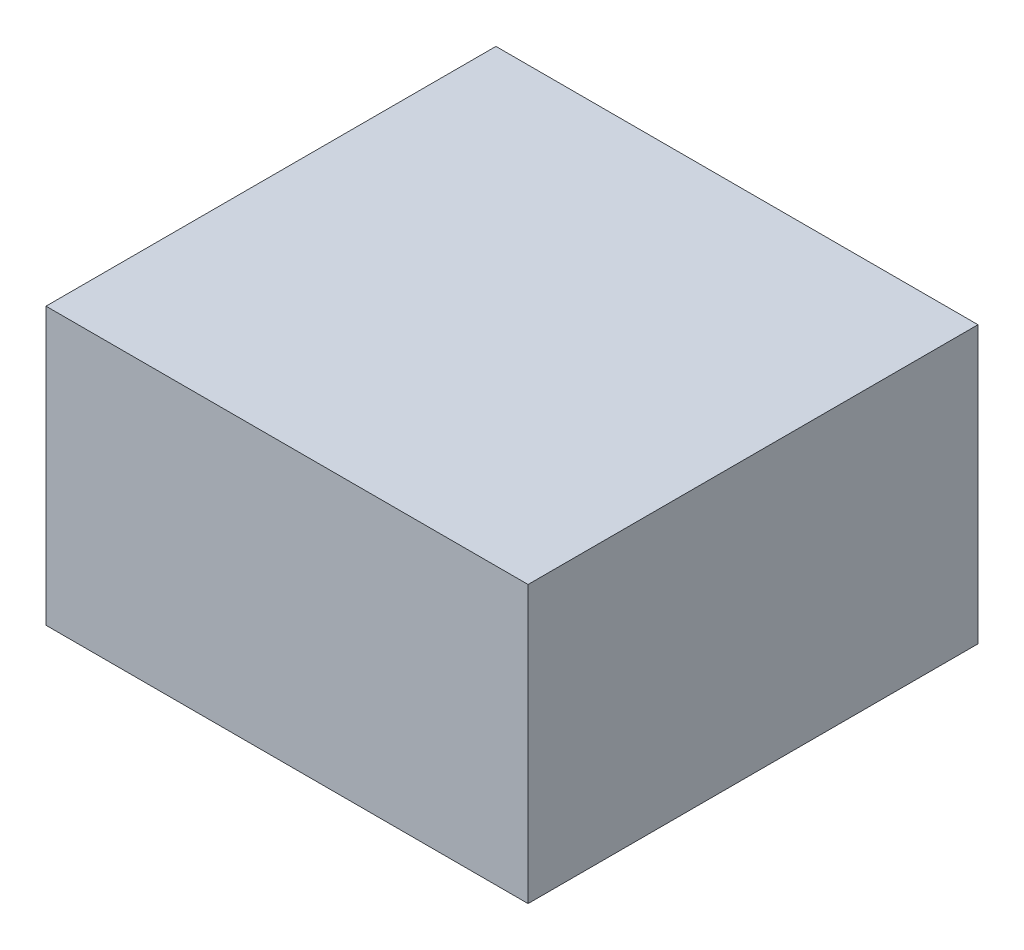
ISO-10303-21;
HEADER;
FILE_DESCRIPTION(('STEP AP214'),'2;1');
FILE_NAME('part.step','',(''),(''),'','','');
FILE_SCHEMA(('AUTOMOTIVE_DESIGN { 1 0 10303 214 1 1 1 1 }'));
ENDSEC;
DATA;
#1=APPLICATION_CONTEXT('core data for automotive mechanical design processes');
#2=APPLICATION_PROTOCOL_DEFINITION('international standard','automotive_design',2000,#1);
#3=PRODUCT_CONTEXT('',#1,'mechanical');
#4=PRODUCT('Part','Part','',(#3));
#5=PRODUCT_RELATED_PRODUCT_CATEGORY('part','',(#4));
#6=PRODUCT_DEFINITION_FORMATION('','',#4);
#7=PRODUCT_DEFINITION_CONTEXT('part definition',#1,'design');
#8=PRODUCT_DEFINITION('design','',#6,#7);
#9=PRODUCT_DEFINITION_SHAPE('','',#8);
#10=(LENGTH_UNIT() NAMED_UNIT(*) SI_UNIT(.MILLI.,.METRE.));
#11=(NAMED_UNIT(*) PLANE_ANGLE_UNIT() SI_UNIT($,.RADIAN.));
#12=(NAMED_UNIT(*) SI_UNIT($,.STERADIAN.) SOLID_ANGLE_UNIT());
#13=UNCERTAINTY_MEASURE_WITH_UNIT(LENGTH_MEASURE(1.E-05),#10,'distance_accuracy_value','');
#14=(GEOMETRIC_REPRESENTATION_CONTEXT(3) GLOBAL_UNCERTAINTY_ASSIGNED_CONTEXT((#13)) GLOBAL_UNIT_ASSIGNED_CONTEXT((#10,
#11,#12)) REPRESENTATION_CONTEXT('',''));
#15=CARTESIAN_POINT('',(0.,0.,0.));
#16=DIRECTION('',(0.,0.,1.));
#17=DIRECTION('',(1.,0.,0.));
#18=AXIS2_PLACEMENT_3D('',#15,#16,#17);
#19=CARTESIAN_POINT('',(0.,0.,140.));
#20=DIRECTION('',(1.,0.,0.));
#21=DIRECTION('',(0.,0.,-1.));
#22=AXIS2_PLACEMENT_3D('',#19,#20,#21);
#23=PLANE('',#22);
#24=DIRECTION('',(0.,-1.,0.));
#25=VECTOR('',#24,1.);
#26=CARTESIAN_POINT('',(0.,0.,0.));
#27=LINE('',#26,#25);
#28=CARTESIAN_POINT('',(0.,86.,0.));
#29=VERTEX_POINT('',#28);
#30=CARTESIAN_POINT('',(0.,0.,0.));
#31=VERTEX_POINT('',#30);
#32=EDGE_CURVE('E98',#29,#31,#27,.T.);
#33=ORIENTED_EDGE('',*,*,#32,.T.);
#34=DIRECTION('',(0.,0.,-1.));
#35=VECTOR('',#34,1.);
#36=CARTESIAN_POINT('',(0.,0.,140.));
#37=LINE('',#36,#35);
#38=CARTESIAN_POINT('',(0.,0.,140.));
#39=VERTEX_POINT('',#38);
#40=EDGE_CURVE('E11',#39,#31,#37,.T.);
#41=ORIENTED_EDGE('',*,*,#40,.F.);
#42=DIRECTION('',(0.,-1.,0.));
#43=VECTOR('',#42,1.);
#44=CARTESIAN_POINT('',(0.,0.,140.));
#45=LINE('',#44,#43);
#46=CARTESIAN_POINT('',(0.,86.,140.));
#47=VERTEX_POINT('',#46);
#48=EDGE_CURVE('E86',#47,#39,#45,.T.);
#49=ORIENTED_EDGE('',*,*,#48,.F.);
#50=DIRECTION('',(0.,0.,-1.));
#51=VECTOR('',#50,1.);
#52=CARTESIAN_POINT('',(0.,86.,140.));
#53=LINE('',#52,#51);
#54=EDGE_CURVE('E94',#47,#29,#53,.T.);
#55=ORIENTED_EDGE('',*,*,#54,.T.);
#56=EDGE_LOOP('',(#33,#41,#49,#55));
#57=FACE_BOUND('',#56,.T.);
#58=ADVANCED_FACE('F35',(#57),#23,.F.);
#59=CARTESIAN_POINT('',(0.,0.,140.));
#60=DIRECTION('',(0.,1.,0.));
#61=DIRECTION('',(0.,0.,1.));
#62=AXIS2_PLACEMENT_3D('',#59,#60,#61);
#63=PLANE('',#62);
#64=DIRECTION('',(1.,0.,0.));
#65=VECTOR('',#64,1.);
#66=CARTESIAN_POINT('',(0.,0.,0.));
#67=LINE('',#66,#65);
#68=CARTESIAN_POINT('',(150.,0.,0.));
#69=VERTEX_POINT('',#68);
#70=EDGE_CURVE('E90',#31,#69,#67,.T.);
#71=ORIENTED_EDGE('',*,*,#70,.T.);
#72=DIRECTION('',(0.,0.,-1.));
#73=VECTOR('',#72,1.);
#74=CARTESIAN_POINT('',(150.,0.,140.));
#75=LINE('',#74,#73);
#76=CARTESIAN_POINT('',(150.,0.,140.));
#77=VERTEX_POINT('',#76);
#78=EDGE_CURVE('E43',#77,#69,#75,.T.);
#79=ORIENTED_EDGE('',*,*,#78,.F.);
#80=DIRECTION('',(1.,0.,0.));
#81=VECTOR('',#80,1.);
#82=CARTESIAN_POINT('',(0.,0.,140.));
#83=LINE('',#82,#81);
#84=EDGE_CURVE('E81',#39,#77,#83,.T.);
#85=ORIENTED_EDGE('',*,*,#84,.F.);
#86=ORIENTED_EDGE('',*,*,#40,.T.);
#87=EDGE_LOOP('',(#71,#79,#85,#86));
#88=FACE_BOUND('',#87,.T.);
#89=ADVANCED_FACE('F89',(#88),#63,.F.);
#90=CARTESIAN_POINT('',(150.,0.,140.));
#91=DIRECTION('',(-1.,0.,0.));
#92=DIRECTION('',(0.,0.,1.));
#93=AXIS2_PLACEMENT_3D('',#90,#91,#92);
#94=PLANE('',#93);
#95=DIRECTION('',(0.,1.,0.));
#96=VECTOR('',#95,1.);
#97=CARTESIAN_POINT('',(150.,0.,0.));
#98=LINE('',#97,#96);
#99=CARTESIAN_POINT('',(150.,86.,0.));
#100=VERTEX_POINT('',#99);
#101=EDGE_CURVE('E68',#69,#100,#98,.T.);
#102=ORIENTED_EDGE('',*,*,#101,.T.);
#103=DIRECTION('',(0.,0.,-1.));
#104=VECTOR('',#103,1.);
#105=CARTESIAN_POINT('',(150.,86.,140.));
#106=LINE('',#105,#104);
#107=CARTESIAN_POINT('',(150.,86.,140.));
#108=VERTEX_POINT('',#107);
#109=EDGE_CURVE('E91',#108,#100,#106,.T.);
#110=ORIENTED_EDGE('',*,*,#109,.F.);
#111=DIRECTION('',(0.,1.,0.));
#112=VECTOR('',#111,1.);
#113=CARTESIAN_POINT('',(150.,0.,140.));
#114=LINE('',#113,#112);
#115=EDGE_CURVE('E84',#77,#108,#114,.T.);
#116=ORIENTED_EDGE('',*,*,#115,.F.);
#117=ORIENTED_EDGE('',*,*,#78,.T.);
#118=EDGE_LOOP('',(#102,#110,#116,#117));
#119=FACE_BOUND('',#118,.T.);
#120=ADVANCED_FACE('F92',(#119),#94,.F.);
#121=CARTESIAN_POINT('',(0.,86.,140.));
#122=DIRECTION('',(0.,-1.,0.));
#123=DIRECTION('',(0.,0.,-1.));
#124=AXIS2_PLACEMENT_3D('',#121,#122,#123);
#125=PLANE('',#124);
#126=DIRECTION('',(-1.,0.,0.));
#127=VECTOR('',#126,1.);
#128=CARTESIAN_POINT('',(0.,86.,0.));
#129=LINE('',#128,#127);
#130=EDGE_CURVE('E74',#100,#29,#129,.T.);
#131=ORIENTED_EDGE('',*,*,#130,.T.);
#132=ORIENTED_EDGE('',*,*,#54,.F.);
#133=DIRECTION('',(-1.,0.,0.));
#134=VECTOR('',#133,1.);
#135=CARTESIAN_POINT('',(0.,86.,140.));
#136=LINE('',#135,#134);
#137=EDGE_CURVE('E51',#108,#47,#136,.T.);
#138=ORIENTED_EDGE('',*,*,#137,.F.);
#139=ORIENTED_EDGE('',*,*,#109,.T.);
#140=EDGE_LOOP('',(#131,#132,#138,#139));
#141=FACE_BOUND('',#140,.T.);
#142=ADVANCED_FACE('F105',(#141),#125,.F.);
#143=CARTESIAN_POINT('',(0.,0.,140.));
#144=DIRECTION('',(0.,0.,-1.));
#145=DIRECTION('',(-1.,0.,0.));
#146=AXIS2_PLACEMENT_3D('',#143,#144,#145);
#147=PLANE('',#146);
#148=ORIENTED_EDGE('',*,*,#48,.T.);
#149=ORIENTED_EDGE('',*,*,#84,.T.);
#150=ORIENTED_EDGE('',*,*,#115,.T.);
#151=ORIENTED_EDGE('',*,*,#137,.T.);
#152=EDGE_LOOP('',(#148,#149,#150,#151));
#153=FACE_BOUND('',#152,.T.);
#154=ADVANCED_FACE('F82',(#153),#147,.F.);
#155=CARTESIAN_POINT('',(0.,0.,0.));
#156=DIRECTION('',(0.,0.,-1.));
#157=DIRECTION('',(-1.,0.,0.));
#158=AXIS2_PLACEMENT_3D('',#155,#156,#157);
#159=PLANE('',#158);
#160=ORIENTED_EDGE('',*,*,#32,.F.);
#161=ORIENTED_EDGE('',*,*,#130,.F.);
#162=ORIENTED_EDGE('',*,*,#101,.F.);
#163=ORIENTED_EDGE('',*,*,#70,.F.);
#164=EDGE_LOOP('',(#160,#161,#162,#163));
#165=FACE_BOUND('',#164,.T.);
#166=ADVANCED_FACE('F108',(#165),#159,.T.);
#167=CLOSED_SHELL('',(#58,#89,#120,#142,#154,#166));
#168=MANIFOLD_SOLID_BREP('B2',#167);
#169=ADVANCED_BREP_SHAPE_REPRESENTATION('',(#18,#168),#14);
#170=SHAPE_DEFINITION_REPRESENTATION(#9,#169);
ENDSEC;
END-ISO-10303-21;
